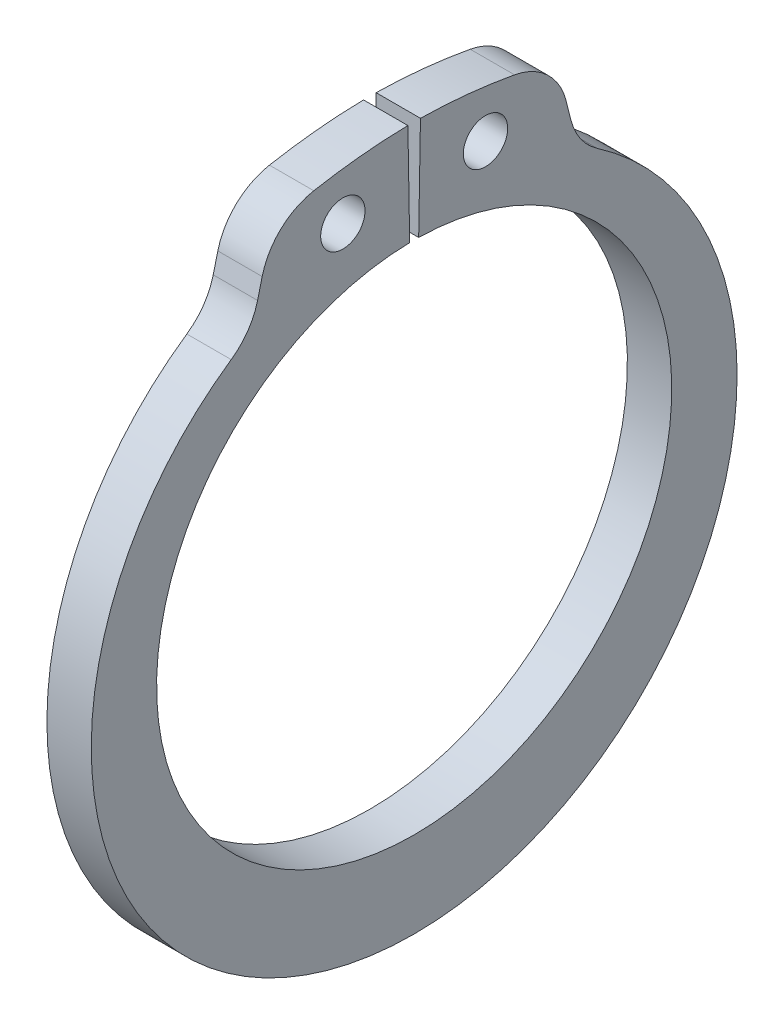
ISO-10303-21;
HEADER;
FILE_DESCRIPTION(('STEP AP214'),'2;1');
FILE_NAME('part.step','',(''),(''),'','','');
FILE_SCHEMA(('AUTOMOTIVE_DESIGN { 1 0 10303 214 1 1 1 1 }'));
ENDSEC;
DATA;
#1=APPLICATION_CONTEXT('core data for automotive mechanical design processes');
#2=APPLICATION_PROTOCOL_DEFINITION('international standard','automotive_design',2000,#1);
#3=PRODUCT_CONTEXT('',#1,'mechanical');
#4=PRODUCT('Part','Part','',(#3));
#5=PRODUCT_RELATED_PRODUCT_CATEGORY('part','',(#4));
#6=PRODUCT_DEFINITION_FORMATION('','',#4);
#7=PRODUCT_DEFINITION_CONTEXT('part definition',#1,'design');
#8=PRODUCT_DEFINITION('design','',#6,#7);
#9=PRODUCT_DEFINITION_SHAPE('','',#8);
#10=(LENGTH_UNIT() NAMED_UNIT(*) SI_UNIT(.MILLI.,.METRE.));
#11=(NAMED_UNIT(*) PLANE_ANGLE_UNIT() SI_UNIT($,.RADIAN.));
#12=(NAMED_UNIT(*) SI_UNIT($,.STERADIAN.) SOLID_ANGLE_UNIT());
#13=UNCERTAINTY_MEASURE_WITH_UNIT(LENGTH_MEASURE(1.E-05),#10,'distance_accuracy_value','');
#14=(GEOMETRIC_REPRESENTATION_CONTEXT(3) GLOBAL_UNCERTAINTY_ASSIGNED_CONTEXT((#13)) GLOBAL_UNIT_ASSIGNED_CONTEXT((#10,
#11,#12)) REPRESENTATION_CONTEXT('',''));
#15=CARTESIAN_POINT('',(0.,0.,0.));
#16=DIRECTION('',(0.,0.,1.));
#17=DIRECTION('',(1.,0.,0.));
#18=AXIS2_PLACEMENT_3D('',#15,#16,#17);
#19=CARTESIAN_POINT('',(0.9906,0.,0.));
#20=DIRECTION('',(1.,0.,0.));
#21=DIRECTION('',(0.,0.,-1.));
#22=AXIS2_PLACEMENT_3D('',#19,#20,#21);
#23=PLANE('',#22);
#24=CARTESIAN_POINT('',(0.9906,13.7386956694485,3.18562375031583));
#25=DIRECTION('',(1.,0.,0.));
#26=DIRECTION('',(0.,0.,-1.));
#27=AXIS2_PLACEMENT_3D('',#24,#25,#26);
#28=CIRCLE('',#27,0.9906);
#29=CARTESIAN_POINT('',(0.9906,13.7386956694485,2.19502375031583));
#30=VERTEX_POINT('',#29);
#31=EDGE_CURVE('E218',#30,#30,#28,.T.);
#32=ORIENTED_EDGE('',*,*,#31,.F.);
#33=EDGE_LOOP('',(#32));
#34=FACE_BOUND('',#33,.T.);
#35=CARTESIAN_POINT('',(0.9906,-9.62190277241611,-0.167950937625521));
#36=DIRECTION('',(1.,0.,0.));
#37=DIRECTION('',(0.,0.,-1.));
#38=AXIS2_PLACEMENT_3D('',#35,#36,#37);
#39=CIRCLE('',#38,25.7015684580441);
#40=CARTESIAN_POINT('',(0.9906,16.0757512122635,0.280603281179932));
#41=VERTEX_POINT('',#40);
#42=CARTESIAN_POINT('',(0.9906,15.6551175075098,4.48423854387066));
#43=VERTEX_POINT('',#42);
#44=EDGE_CURVE('E135',#41,#43,#39,.T.);
#45=ORIENTED_EDGE('',*,*,#44,.T.);
#46=CARTESIAN_POINT('',(0.9906,12.7823676845489,3.95551417836614));
#47=DIRECTION('',(1.,0.,0.));
#48=DIRECTION('',(0.,0.,-1.));
#49=AXIS2_PLACEMENT_3D('',#46,#47,#48);
#50=CIRCLE('',#49,2.921);
#51=CARTESIAN_POINT('',(0.9906,13.4890215415955,6.78974799481833));
#52=VERTEX_POINT('',#51);
#53=EDGE_CURVE('E172',#43,#52,#50,.T.);
#54=ORIENTED_EDGE('',*,*,#53,.T.);
#55=DIRECTION('',(0.,-0.970295726275997,0.241921895599664));
#56=VECTOR('',#55,1.);
#57=CARTESIAN_POINT('',(0.9906,15.2385208359464,6.35354882978227));
#58=LINE('',#57,#56);
#59=CARTESIAN_POINT('',(0.9906,12.6673759307559,6.99460725401382));
#60=VERTEX_POINT('',#59);
#61=EDGE_CURVE('E210',#52,#60,#58,.T.);
#62=ORIENTED_EDGE('',*,*,#61,.T.);
#63=CARTESIAN_POINT('',(0.9906,13.3740297878026,9.82884107046601));
#64=DIRECTION('',(1.,0.,0.));
#65=DIRECTION('',(0.,0.,-1.));
#66=AXIS2_PLACEMENT_3D('',#63,#64,#65);
#67=CIRCLE('',#66,2.921);
#68=CARTESIAN_POINT('',(0.9906,10.9672730256424,8.17361815865124));
#69=VERTEX_POINT('',#68);
#70=EDGE_CURVE('E183',#60,#69,#67,.F.);
#71=ORIENTED_EDGE('',*,*,#70,.T.);
#72=CARTESIAN_POINT('',(0.9906,-0.917477139566747,0.));
#73=DIRECTION('',(1.,0.,0.));
#74=DIRECTION('',(0.,0.,-1.));
#75=AXIS2_PLACEMENT_3D('',#72,#73,#74);
#76=CIRCLE('',#75,14.4241228604332);
#77=CARTESIAN_POINT('',(0.9906,10.9672730256424,-8.1736181586513));
#78=VERTEX_POINT('',#77);
#79=EDGE_CURVE('E205',#69,#78,#76,.T.);
#80=ORIENTED_EDGE('',*,*,#79,.T.);
#81=CARTESIAN_POINT('',(0.9906,13.3740297878025,-9.82884107046608));
#82=DIRECTION('',(1.,0.,0.));
#83=DIRECTION('',(0.,0.,-1.));
#84=AXIS2_PLACEMENT_3D('',#81,#82,#83);
#85=CIRCLE('',#84,2.921);
#86=CARTESIAN_POINT('',(0.9906,12.6673759307558,-6.99460725401391));
#87=VERTEX_POINT('',#86);
#88=EDGE_CURVE('E11',#78,#87,#85,.F.);
#89=ORIENTED_EDGE('',*,*,#88,.T.);
#90=DIRECTION('',(0.,0.970295726275991,0.241921895599687));
#91=VECTOR('',#90,1.);
#92=CARTESIAN_POINT('',(0.9906,15.2385208359464,-6.35354882978226));
#93=LINE('',#92,#91);
#94=CARTESIAN_POINT('',(0.9906,13.4890215415955,-6.78974799481836));
#95=VERTEX_POINT('',#94);
#96=EDGE_CURVE('E204',#87,#95,#93,.T.);
#97=ORIENTED_EDGE('',*,*,#96,.T.);
#98=CARTESIAN_POINT('',(0.9906,12.7823676845488,-3.95551417836619));
#99=DIRECTION('',(1.,0.,0.));
#100=DIRECTION('',(0.,0.,-1.));
#101=AXIS2_PLACEMENT_3D('',#98,#99,#100);
#102=CIRCLE('',#101,2.921);
#103=CARTESIAN_POINT('',(0.9906,15.6551175075097,-4.48423854387069));
#104=VERTEX_POINT('',#103);
#105=EDGE_CURVE('E50',#95,#104,#102,.T.);
#106=ORIENTED_EDGE('',*,*,#105,.T.);
#107=CARTESIAN_POINT('',(0.9906,-9.62190277241895,0.167950937625904));
#108=DIRECTION('',(1.,0.,0.));
#109=DIRECTION('',(0.,0.,1.));
#110=AXIS2_PLACEMENT_3D('',#107,#108,#109);
#111=CIRCLE('',#110,25.7015684580469);
#112=CARTESIAN_POINT('',(0.9906,16.0757512122635,-0.280603281179933));
#113=VERTEX_POINT('',#112);
#114=EDGE_CURVE('E207',#104,#113,#111,.T.);
#115=ORIENTED_EDGE('',*,*,#114,.T.);
#116=DIRECTION('',(0.,-0.999847695156391,0.0174524064372835));
#117=VECTOR('',#116,1.);
#118=CARTESIAN_POINT('',(0.9906,16.0757512122635,-0.280603281179932));
#119=LINE('',#118,#117);
#120=CARTESIAN_POINT('',(0.9906,11.5044475500085,-0.200810878948672));
#121=VERTEX_POINT('',#120);
#122=EDGE_CURVE('E141',#113,#121,#119,.T.);
#123=ORIENTED_EDGE('',*,*,#122,.T.);
#124=CARTESIAN_POINT('',(0.9906,0.,0.));
#125=DIRECTION('',(-1.,0.,0.));
#126=DIRECTION('',(0.,0.,-1.));
#127=AXIS2_PLACEMENT_3D('',#124,#125,#126);
#128=CIRCLE('',#127,11.5062);
#129=CARTESIAN_POINT('',(0.9906,11.5044475500085,0.200810878948672));
#130=VERTEX_POINT('',#129);
#131=EDGE_CURVE('E136',#121,#130,#128,.T.);
#132=ORIENTED_EDGE('',*,*,#131,.T.);
#133=DIRECTION('',(0.,0.999847695156391,0.0174524064372835));
#134=VECTOR('',#133,1.);
#135=CARTESIAN_POINT('',(0.9906,11.5044475500085,0.200810878948672));
#136=LINE('',#135,#134);
#137=EDGE_CURVE('E125',#130,#41,#136,.T.);
#138=ORIENTED_EDGE('',*,*,#137,.T.);
#139=EDGE_LOOP('',(#45,#54,#62,#71,#80,#89,#97,#106,#115,#123,#132,#138));
#140=FACE_BOUND('',#139,.T.);
#141=CARTESIAN_POINT('',(0.9906,13.7386956694485,-3.18562375031583));
#142=DIRECTION('',(1.,0.,0.));
#143=DIRECTION('',(0.,0.,-1.));
#144=AXIS2_PLACEMENT_3D('',#141,#142,#143);
#145=CIRCLE('',#144,0.9906);
#146=CARTESIAN_POINT('',(0.9906,13.7386956694485,-4.17622375031583));
#147=VERTEX_POINT('',#146);
#148=EDGE_CURVE('E247',#147,#147,#145,.T.);
#149=ORIENTED_EDGE('',*,*,#148,.F.);
#150=EDGE_LOOP('',(#149));
#151=FACE_BOUND('',#150,.T.);
#152=ADVANCED_FACE('F35',(#34,#140,#151),#23,.T.);
#153=CARTESIAN_POINT('',(-0.9906,0.,0.));
#154=DIRECTION('',(1.,0.,0.));
#155=DIRECTION('',(0.,0.,-1.));
#156=AXIS2_PLACEMENT_3D('',#153,#154,#155);
#157=PLANE('',#156);
#158=CARTESIAN_POINT('',(-0.9906,13.7386956694485,3.18562375031583));
#159=DIRECTION('',(1.,0.,0.));
#160=DIRECTION('',(0.,0.,-1.));
#161=AXIS2_PLACEMENT_3D('',#158,#159,#160);
#162=CIRCLE('',#161,0.9906);
#163=CARTESIAN_POINT('',(-0.9906,13.7386956694485,2.19502375031583));
#164=VERTEX_POINT('',#163);
#165=EDGE_CURVE('E244',#164,#164,#162,.T.);
#166=ORIENTED_EDGE('',*,*,#165,.T.);
#167=EDGE_LOOP('',(#166));
#168=FACE_BOUND('',#167,.T.);
#169=DIRECTION('',(0.,-0.970295726275997,0.241921895599664));
#170=VECTOR('',#169,1.);
#171=CARTESIAN_POINT('',(-0.9906,15.2385208359464,6.35354882978227));
#172=LINE('',#171,#170);
#173=CARTESIAN_POINT('',(-0.9906,13.4890215415955,6.78974799481833));
#174=VERTEX_POINT('',#173);
#175=CARTESIAN_POINT('',(-0.9906,12.6673759307559,6.99460725401382));
#176=VERTEX_POINT('',#175);
#177=EDGE_CURVE('E201',#174,#176,#172,.T.);
#178=ORIENTED_EDGE('',*,*,#177,.F.);
#179=CARTESIAN_POINT('',(-0.9906,12.7823676845489,3.95551417836614));
#180=DIRECTION('',(1.,0.,0.));
#181=DIRECTION('',(0.,0.,-1.));
#182=AXIS2_PLACEMENT_3D('',#179,#180,#181);
#183=CIRCLE('',#182,2.921);
#184=CARTESIAN_POINT('',(-0.9906,15.6551175075098,4.48423854387066));
#185=VERTEX_POINT('',#184);
#186=EDGE_CURVE('E167',#174,#185,#183,.F.);
#187=ORIENTED_EDGE('',*,*,#186,.T.);
#188=CARTESIAN_POINT('',(-0.9906,-9.62190277241611,-0.167950937625521));
#189=DIRECTION('',(1.,0.,0.));
#190=DIRECTION('',(0.,0.,-1.));
#191=AXIS2_PLACEMENT_3D('',#188,#189,#190);
#192=CIRCLE('',#191,25.7015684580441);
#193=CARTESIAN_POINT('',(-0.9906,16.0757512122635,0.280603281179932));
#194=VERTEX_POINT('',#193);
#195=EDGE_CURVE('E220',#194,#185,#192,.T.);
#196=ORIENTED_EDGE('',*,*,#195,.F.);
#197=DIRECTION('',(0.,0.999847695156391,0.0174524064372835));
#198=VECTOR('',#197,1.);
#199=CARTESIAN_POINT('',(-0.9906,11.5044475500085,0.200810878948672));
#200=LINE('',#199,#198);
#201=CARTESIAN_POINT('',(-0.9906,11.5044475500085,0.200810878948672));
#202=VERTEX_POINT('',#201);
#203=EDGE_CURVE('E217',#202,#194,#200,.T.);
#204=ORIENTED_EDGE('',*,*,#203,.F.);
#205=CARTESIAN_POINT('',(-0.9906,0.,0.));
#206=DIRECTION('',(-1.,0.,0.));
#207=DIRECTION('',(0.,0.,-1.));
#208=AXIS2_PLACEMENT_3D('',#205,#206,#207);
#209=CIRCLE('',#208,11.5062);
#210=CARTESIAN_POINT('',(-0.9906,11.5044475500085,-0.200810878948672));
#211=VERTEX_POINT('',#210);
#212=EDGE_CURVE('E149',#211,#202,#209,.T.);
#213=ORIENTED_EDGE('',*,*,#212,.F.);
#214=DIRECTION('',(0.,-0.999847695156391,0.0174524064372835));
#215=VECTOR('',#214,1.);
#216=CARTESIAN_POINT('',(-0.9906,16.0757512122635,-0.280603281179932));
#217=LINE('',#216,#215);
#218=CARTESIAN_POINT('',(-0.9906,16.0757512122635,-0.280603281179933));
#219=VERTEX_POINT('',#218);
#220=EDGE_CURVE('E145',#219,#211,#217,.T.);
#221=ORIENTED_EDGE('',*,*,#220,.F.);
#222=CARTESIAN_POINT('',(-0.9906,-9.62190277241895,0.167950937625904));
#223=DIRECTION('',(1.,0.,0.));
#224=DIRECTION('',(0.,0.,1.));
#225=AXIS2_PLACEMENT_3D('',#222,#223,#224);
#226=CIRCLE('',#225,25.7015684580469);
#227=CARTESIAN_POINT('',(-0.9906,15.6551175075097,-4.48423854387069));
#228=VERTEX_POINT('',#227);
#229=EDGE_CURVE('E226',#228,#219,#226,.T.);
#230=ORIENTED_EDGE('',*,*,#229,.F.);
#231=CARTESIAN_POINT('',(-0.9906,12.7823676845488,-3.95551417836619));
#232=DIRECTION('',(1.,0.,0.));
#233=DIRECTION('',(0.,0.,-1.));
#234=AXIS2_PLACEMENT_3D('',#231,#232,#233);
#235=CIRCLE('',#234,2.921);
#236=CARTESIAN_POINT('',(-0.9906,13.4890215415955,-6.78974799481836));
#237=VERTEX_POINT('',#236);
#238=EDGE_CURVE('E165',#228,#237,#235,.F.);
#239=ORIENTED_EDGE('',*,*,#238,.T.);
#240=DIRECTION('',(0.,0.970295726275991,0.241921895599687));
#241=VECTOR('',#240,1.);
#242=CARTESIAN_POINT('',(-0.9906,15.2385208359464,-6.35354882978226));
#243=LINE('',#242,#241);
#244=CARTESIAN_POINT('',(-0.9906,12.6673759307558,-6.99460725401391));
#245=VERTEX_POINT('',#244);
#246=EDGE_CURVE('E192',#245,#237,#243,.T.);
#247=ORIENTED_EDGE('',*,*,#246,.F.);
#248=CARTESIAN_POINT('',(-0.9906,13.3740297878025,-9.82884107046608));
#249=DIRECTION('',(1.,0.,0.));
#250=DIRECTION('',(0.,0.,-1.));
#251=AXIS2_PLACEMENT_3D('',#248,#249,#250);
#252=CIRCLE('',#251,2.921);
#253=CARTESIAN_POINT('',(-0.9906,10.9672730256424,-8.1736181586513));
#254=VERTEX_POINT('',#253);
#255=EDGE_CURVE('E43',#245,#254,#252,.T.);
#256=ORIENTED_EDGE('',*,*,#255,.T.);
#257=CARTESIAN_POINT('',(-0.9906,-0.917477139566747,0.));
#258=DIRECTION('',(1.,0.,0.));
#259=DIRECTION('',(0.,0.,-1.));
#260=AXIS2_PLACEMENT_3D('',#257,#258,#259);
#261=CIRCLE('',#260,14.4241228604332);
#262=CARTESIAN_POINT('',(-0.9906,10.9672730256424,8.17361815865124));
#263=VERTEX_POINT('',#262);
#264=EDGE_CURVE('E191',#263,#254,#261,.T.);
#265=ORIENTED_EDGE('',*,*,#264,.F.);
#266=CARTESIAN_POINT('',(-0.9906,13.3740297878026,9.82884107046601));
#267=DIRECTION('',(1.,0.,0.));
#268=DIRECTION('',(0.,0.,-1.));
#269=AXIS2_PLACEMENT_3D('',#266,#267,#268);
#270=CIRCLE('',#269,2.921);
#271=EDGE_CURVE('E181',#263,#176,#270,.T.);
#272=ORIENTED_EDGE('',*,*,#271,.T.);
#273=EDGE_LOOP('',(#178,#187,#196,#204,#213,#221,#230,#239,#247,#256,#265,#272));
#274=FACE_BOUND('',#273,.T.);
#275=CARTESIAN_POINT('',(-0.9906,13.7386956694485,-3.18562375031583));
#276=DIRECTION('',(1.,0.,0.));
#277=DIRECTION('',(0.,0.,-1.));
#278=AXIS2_PLACEMENT_3D('',#275,#276,#277);
#279=CIRCLE('',#278,0.9906);
#280=CARTESIAN_POINT('',(-0.9906,13.7386956694485,-4.17622375031583));
#281=VERTEX_POINT('',#280);
#282=EDGE_CURVE('E250',#281,#281,#279,.T.);
#283=ORIENTED_EDGE('',*,*,#282,.T.);
#284=EDGE_LOOP('',(#283));
#285=FACE_BOUND('',#284,.T.);
#286=ADVANCED_FACE('F189',(#168,#274,#285),#157,.F.);
#287=CARTESIAN_POINT('',(0.9906,0.,0.));
#288=DIRECTION('',(-1.,0.,0.));
#289=DIRECTION('',(0.,0.,1.));
#290=AXIS2_PLACEMENT_3D('',#287,#288,#289);
#291=CYLINDRICAL_SURFACE('',#290,11.5062);
#292=ORIENTED_EDGE('',*,*,#212,.T.);
#293=DIRECTION('',(-1.,0.,0.));
#294=VECTOR('',#293,1.);
#295=CARTESIAN_POINT('',(0.9906,11.5044475500085,0.200810878948672));
#296=LINE('',#295,#294);
#297=EDGE_CURVE('E129',#130,#202,#296,.T.);
#298=ORIENTED_EDGE('',*,*,#297,.F.);
#299=ORIENTED_EDGE('',*,*,#131,.F.);
#300=DIRECTION('',(-1.,0.,0.));
#301=VECTOR('',#300,1.);
#302=CARTESIAN_POINT('',(0.9906,11.5044475500085,-0.200810878948672));
#303=LINE('',#302,#301);
#304=EDGE_CURVE('E215',#121,#211,#303,.T.);
#305=ORIENTED_EDGE('',*,*,#304,.T.);
#306=EDGE_LOOP('',(#292,#298,#299,#305));
#307=FACE_BOUND('',#306,.T.);
#308=ADVANCED_FACE('F147',(#307),#291,.F.);
#309=CARTESIAN_POINT('',(0.9906,11.5044475500085,0.200810878948672));
#310=DIRECTION('',(0.,-0.0174524064372835,0.999847695156391));
#311=DIRECTION('',(0.,-0.999847695156391,-0.0174524064372835));
#312=AXIS2_PLACEMENT_3D('',#309,#310,#311);
#313=PLANE('',#312);
#314=ORIENTED_EDGE('',*,*,#203,.T.);
#315=DIRECTION('',(-1.,0.,0.));
#316=VECTOR('',#315,1.);
#317=CARTESIAN_POINT('',(0.9906,16.0757512122635,0.280603281179932));
#318=LINE('',#317,#316);
#319=EDGE_CURVE('E132',#41,#194,#318,.T.);
#320=ORIENTED_EDGE('',*,*,#319,.F.);
#321=ORIENTED_EDGE('',*,*,#137,.F.);
#322=ORIENTED_EDGE('',*,*,#297,.T.);
#323=EDGE_LOOP('',(#314,#320,#321,#322));
#324=FACE_BOUND('',#323,.T.);
#325=ADVANCED_FACE('F127',(#324),#313,.F.);
#326=CARTESIAN_POINT('',(0.9906,-9.62190277241611,-0.167950937625521));
#327=DIRECTION('',(-1.,0.,0.));
#328=DIRECTION('',(0.,0.,1.));
#329=AXIS2_PLACEMENT_3D('',#326,#327,#328);
#330=CYLINDRICAL_SURFACE('',#329,25.7015684580441);
#331=ORIENTED_EDGE('',*,*,#195,.T.);
#332=DIRECTION('',(-1.,0.,0.));
#333=VECTOR('',#332,1.);
#334=CARTESIAN_POINT('',(0.9906,15.6551175075098,4.48423854387066));
#335=LINE('',#334,#333);
#336=EDGE_CURVE('E169',#185,#43,#335,.F.);
#337=ORIENTED_EDGE('',*,*,#336,.T.);
#338=ORIENTED_EDGE('',*,*,#44,.F.);
#339=ORIENTED_EDGE('',*,*,#319,.T.);
#340=EDGE_LOOP('',(#331,#337,#338,#339));
#341=FACE_BOUND('',#340,.T.);
#342=ADVANCED_FACE('F238',(#341),#330,.T.);
#343=CARTESIAN_POINT('',(0.9906,15.2385208359464,6.35354882978227));
#344=DIRECTION('',(0.,-0.241921895599664,-0.970295726275997));
#345=DIRECTION('',(0.,0.970295726275997,-0.241921895599664));
#346=AXIS2_PLACEMENT_3D('',#343,#344,#345);
#347=PLANE('',#346);
#348=ORIENTED_EDGE('',*,*,#177,.T.);
#349=DIRECTION('',(1.,0.,0.));
#350=VECTOR('',#349,1.);
#351=CARTESIAN_POINT('',(0.9906,12.6673759307559,6.99460725401382));
#352=LINE('',#351,#350);
#353=EDGE_CURVE('E163',#176,#60,#352,.T.);
#354=ORIENTED_EDGE('',*,*,#353,.T.);
#355=ORIENTED_EDGE('',*,*,#61,.F.);
#356=DIRECTION('',(-1.,0.,0.));
#357=VECTOR('',#356,1.);
#358=CARTESIAN_POINT('',(0.9906,13.4890215415955,6.78974799481833));
#359=LINE('',#358,#357);
#360=EDGE_CURVE('E160',#52,#174,#359,.T.);
#361=ORIENTED_EDGE('',*,*,#360,.T.);
#362=EDGE_LOOP('',(#348,#354,#355,#361));
#363=FACE_BOUND('',#362,.T.);
#364=ADVANCED_FACE('F280',(#363),#347,.F.);
#365=CARTESIAN_POINT('',(0.9906,-0.917477139566747,0.));
#366=DIRECTION('',(-1.,0.,0.));
#367=DIRECTION('',(0.,0.,1.));
#368=AXIS2_PLACEMENT_3D('',#365,#366,#367);
#369=CYLINDRICAL_SURFACE('',#368,14.4241228604332);
#370=ORIENTED_EDGE('',*,*,#79,.F.);
#371=DIRECTION('',(-1.,0.,0.));
#372=VECTOR('',#371,1.);
#373=CARTESIAN_POINT('',(0.9906,10.9672730256424,8.17361815865124));
#374=LINE('',#373,#372);
#375=EDGE_CURVE('E152',#69,#263,#374,.T.);
#376=ORIENTED_EDGE('',*,*,#375,.T.);
#377=ORIENTED_EDGE('',*,*,#264,.T.);
#378=DIRECTION('',(-1.,0.,0.));
#379=VECTOR('',#378,1.);
#380=CARTESIAN_POINT('',(0.9906,10.9672730256424,-8.1736181586513));
#381=LINE('',#380,#379);
#382=EDGE_CURVE('E150',#254,#78,#381,.F.);
#383=ORIENTED_EDGE('',*,*,#382,.T.);
#384=EDGE_LOOP('',(#370,#376,#377,#383));
#385=FACE_BOUND('',#384,.T.);
#386=ADVANCED_FACE('F198',(#385),#369,.T.);
#387=CARTESIAN_POINT('',(0.9906,15.2385208359464,-6.35354882978226));
#388=DIRECTION('',(0.,-0.241921895599687,0.970295726275992));
#389=DIRECTION('',(0.,-0.970295726275992,-0.241921895599687));
#390=AXIS2_PLACEMENT_3D('',#387,#388,#389);
#391=PLANE('',#390);
#392=ORIENTED_EDGE('',*,*,#246,.T.);
#393=DIRECTION('',(-1.,0.,0.));
#394=VECTOR('',#393,1.);
#395=CARTESIAN_POINT('',(0.9906,13.4890215415955,-6.78974799481836));
#396=LINE('',#395,#394);
#397=EDGE_CURVE('E58',#237,#95,#396,.F.);
#398=ORIENTED_EDGE('',*,*,#397,.T.);
#399=ORIENTED_EDGE('',*,*,#96,.F.);
#400=DIRECTION('',(1.,0.,0.));
#401=VECTOR('',#400,1.);
#402=CARTESIAN_POINT('',(-0.9906,12.6673759307558,-6.99460725401391));
#403=LINE('',#402,#401);
#404=EDGE_CURVE('E177',#87,#245,#403,.F.);
#405=ORIENTED_EDGE('',*,*,#404,.T.);
#406=EDGE_LOOP('',(#392,#398,#399,#405));
#407=FACE_BOUND('',#406,.T.);
#408=ADVANCED_FACE('F206',(#407),#391,.F.);
#409=CARTESIAN_POINT('',(0.9906,-9.62190277241895,0.167950937625904));
#410=DIRECTION('',(-1.,0.,0.));
#411=DIRECTION('',(0.,0.,1.));
#412=AXIS2_PLACEMENT_3D('',#409,#410,#411);
#413=CYLINDRICAL_SURFACE('',#412,25.7015684580469);
#414=ORIENTED_EDGE('',*,*,#114,.F.);
#415=DIRECTION('',(-1.,0.,0.));
#416=VECTOR('',#415,1.);
#417=CARTESIAN_POINT('',(0.9906,15.6551175075097,-4.48423854387069));
#418=LINE('',#417,#416);
#419=EDGE_CURVE('E174',#104,#228,#418,.T.);
#420=ORIENTED_EDGE('',*,*,#419,.T.);
#421=ORIENTED_EDGE('',*,*,#229,.T.);
#422=DIRECTION('',(-1.,0.,0.));
#423=VECTOR('',#422,1.);
#424=CARTESIAN_POINT('',(0.9906,16.0757512122635,-0.280603281179933));
#425=LINE('',#424,#423);
#426=EDGE_CURVE('E154',#113,#219,#425,.T.);
#427=ORIENTED_EDGE('',*,*,#426,.F.);
#428=EDGE_LOOP('',(#414,#420,#421,#427));
#429=FACE_BOUND('',#428,.T.);
#430=ADVANCED_FACE('F273',(#429),#413,.T.);
#431=CARTESIAN_POINT('',(0.9906,16.0757512122635,-0.280603281179932));
#432=DIRECTION('',(0.,-0.0174524064372835,-0.999847695156391));
#433=DIRECTION('',(0.,0.999847695156391,-0.0174524064372835));
#434=AXIS2_PLACEMENT_3D('',#431,#432,#433);
#435=PLANE('',#434);
#436=ORIENTED_EDGE('',*,*,#220,.T.);
#437=ORIENTED_EDGE('',*,*,#304,.F.);
#438=ORIENTED_EDGE('',*,*,#122,.F.);
#439=ORIENTED_EDGE('',*,*,#426,.T.);
#440=EDGE_LOOP('',(#436,#437,#438,#439));
#441=FACE_BOUND('',#440,.T.);
#442=ADVANCED_FACE('F233',(#441),#435,.F.);
#443=CARTESIAN_POINT('',(0.9906,13.7386956694485,3.18562375031583));
#444=DIRECTION('',(-1.,0.,0.));
#445=DIRECTION('',(0.,0.,1.));
#446=AXIS2_PLACEMENT_3D('',#443,#444,#445);
#447=CYLINDRICAL_SURFACE('',#446,0.9906);
#448=ORIENTED_EDGE('',*,*,#31,.T.);
#449=EDGE_LOOP('',(#448));
#450=FACE_BOUND('',#449,.T.);
#451=ORIENTED_EDGE('',*,*,#165,.F.);
#452=EDGE_LOOP('',(#451));
#453=FACE_BOUND('',#452,.T.);
#454=ADVANCED_FACE('F268',(#450,#453),#447,.F.);
#455=CARTESIAN_POINT('',(0.9906,13.7386956694485,-3.18562375031583));
#456=DIRECTION('',(-1.,0.,0.));
#457=DIRECTION('',(0.,0.,1.));
#458=AXIS2_PLACEMENT_3D('',#455,#456,#457);
#459=CYLINDRICAL_SURFACE('',#458,0.9906);
#460=ORIENTED_EDGE('',*,*,#148,.T.);
#461=EDGE_LOOP('',(#460));
#462=FACE_BOUND('',#461,.T.);
#463=ORIENTED_EDGE('',*,*,#282,.F.);
#464=EDGE_LOOP('',(#463));
#465=FACE_BOUND('',#464,.T.);
#466=ADVANCED_FACE('F256',(#462,#465),#459,.F.);
#467=CARTESIAN_POINT('',(0.9906,13.3740297878026,9.82884107046601));
#468=DIRECTION('',(-1.,0.,0.));
#469=DIRECTION('',(0.,0.,1.));
#470=AXIS2_PLACEMENT_3D('',#467,#468,#469);
#471=CYLINDRICAL_SURFACE('',#470,2.921);
#472=ORIENTED_EDGE('',*,*,#70,.F.);
#473=ORIENTED_EDGE('',*,*,#353,.F.);
#474=ORIENTED_EDGE('',*,*,#271,.F.);
#475=ORIENTED_EDGE('',*,*,#375,.F.);
#476=EDGE_LOOP('',(#472,#473,#474,#475));
#477=FACE_BOUND('',#476,.T.);
#478=ADVANCED_FACE('F290',(#477),#471,.F.);
#479=CARTESIAN_POINT('',(0.9906,12.7823676845489,3.95551417836614));
#480=DIRECTION('',(-1.,0.,0.));
#481=DIRECTION('',(0.,0.,1.));
#482=AXIS2_PLACEMENT_3D('',#479,#480,#481);
#483=CYLINDRICAL_SURFACE('',#482,2.921);
#484=ORIENTED_EDGE('',*,*,#53,.F.);
#485=ORIENTED_EDGE('',*,*,#336,.F.);
#486=ORIENTED_EDGE('',*,*,#186,.F.);
#487=ORIENTED_EDGE('',*,*,#360,.F.);
#488=EDGE_LOOP('',(#484,#485,#486,#487));
#489=FACE_BOUND('',#488,.T.);
#490=ADVANCED_FACE('F293',(#489),#483,.T.);
#491=CARTESIAN_POINT('',(0.9906,12.7823676845488,-3.95551417836619));
#492=DIRECTION('',(-1.,0.,0.));
#493=DIRECTION('',(0.,0.,1.));
#494=AXIS2_PLACEMENT_3D('',#491,#492,#493);
#495=CYLINDRICAL_SURFACE('',#494,2.921);
#496=ORIENTED_EDGE('',*,*,#105,.F.);
#497=ORIENTED_EDGE('',*,*,#397,.F.);
#498=ORIENTED_EDGE('',*,*,#238,.F.);
#499=ORIENTED_EDGE('',*,*,#419,.F.);
#500=EDGE_LOOP('',(#496,#497,#498,#499));
#501=FACE_BOUND('',#500,.T.);
#502=ADVANCED_FACE('F296',(#501),#495,.T.);
#503=CARTESIAN_POINT('',(0.9906,13.3740297878025,-9.82884107046608));
#504=DIRECTION('',(-1.,0.,0.));
#505=DIRECTION('',(0.,0.,1.));
#506=AXIS2_PLACEMENT_3D('',#503,#504,#505);
#507=CYLINDRICAL_SURFACE('',#506,2.921);
#508=ORIENTED_EDGE('',*,*,#88,.F.);
#509=ORIENTED_EDGE('',*,*,#382,.F.);
#510=ORIENTED_EDGE('',*,*,#255,.F.);
#511=ORIENTED_EDGE('',*,*,#404,.F.);
#512=EDGE_LOOP('',(#508,#509,#510,#511));
#513=FACE_BOUND('',#512,.T.);
#514=ADVANCED_FACE('F37',(#513),#507,.F.);
#515=CLOSED_SHELL('',(#152,#286,#308,#325,#342,#364,#386,#408,#430,#442,#454,#466,#478,#490,
#502,#514));
#516=MANIFOLD_SOLID_BREP('B2',#515);
#517=ADVANCED_BREP_SHAPE_REPRESENTATION('',(#18,#516),#14);
#518=SHAPE_DEFINITION_REPRESENTATION(#9,#517);
ENDSEC;
END-ISO-10303-21;
